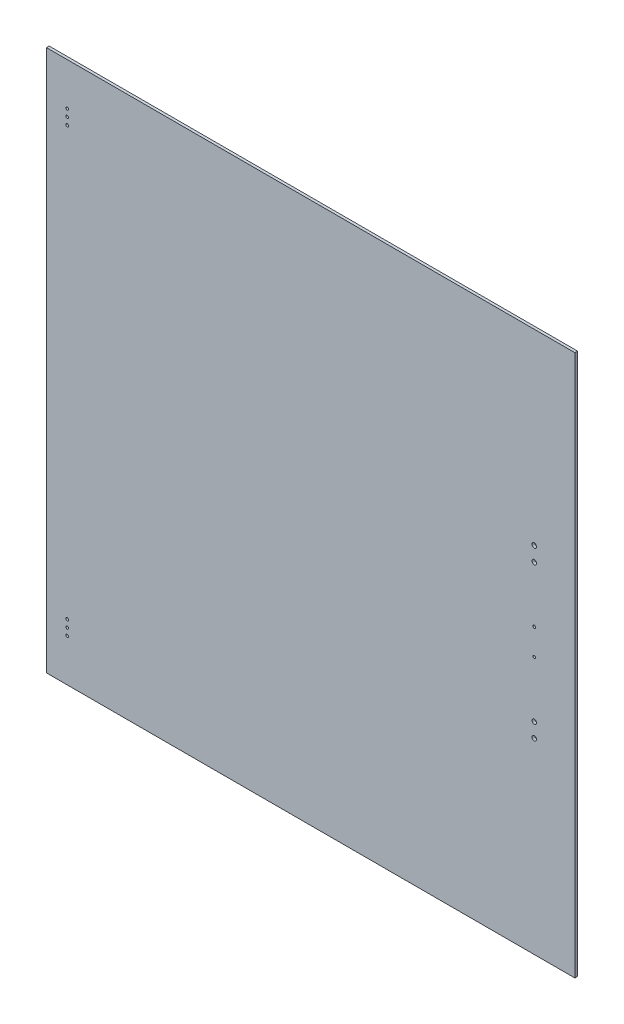
ISO-10303-21;
HEADER;
FILE_DESCRIPTION(('STEP AP214'),'2;1');
FILE_NAME('part.step','',(''),(''),'','','');
FILE_SCHEMA(('AUTOMOTIVE_DESIGN { 1 0 10303 214 1 1 1 1 }'));
ENDSEC;
DATA;
#1=APPLICATION_CONTEXT('core data for automotive mechanical design processes');
#2=APPLICATION_PROTOCOL_DEFINITION('international standard','automotive_design',2000,#1);
#3=PRODUCT_CONTEXT('',#1,'mechanical');
#4=PRODUCT('Part','Part','',(#3));
#5=PRODUCT_RELATED_PRODUCT_CATEGORY('part','',(#4));
#6=PRODUCT_DEFINITION_FORMATION('','',#4);
#7=PRODUCT_DEFINITION_CONTEXT('part definition',#1,'design');
#8=PRODUCT_DEFINITION('design','',#6,#7);
#9=PRODUCT_DEFINITION_SHAPE('','',#8);
#10=(LENGTH_UNIT() NAMED_UNIT(*) SI_UNIT(.MILLI.,.METRE.));
#11=(NAMED_UNIT(*) PLANE_ANGLE_UNIT() SI_UNIT($,.RADIAN.));
#12=(NAMED_UNIT(*) SI_UNIT($,.STERADIAN.) SOLID_ANGLE_UNIT());
#13=UNCERTAINTY_MEASURE_WITH_UNIT(LENGTH_MEASURE(1.E-05),#10,'distance_accuracy_value','');
#14=(GEOMETRIC_REPRESENTATION_CONTEXT(3) GLOBAL_UNCERTAINTY_ASSIGNED_CONTEXT((#13)) GLOBAL_UNIT_ASSIGNED_CONTEXT((#10,
#11,#12)) REPRESENTATION_CONTEXT('',''));
#15=CARTESIAN_POINT('',(0.,0.,0.));
#16=DIRECTION('',(0.,0.,1.));
#17=DIRECTION('',(1.,0.,0.));
#18=AXIS2_PLACEMENT_3D('',#15,#16,#17);
#19=CARTESIAN_POINT('',(-476.504854368932,294.757281553398,3.));
#20=DIRECTION('',(1.,0.,0.));
#21=DIRECTION('',(0.,0.,-1.));
#22=AXIS2_PLACEMENT_3D('',#19,#20,#21);
#23=PLANE('',#22);
#24=DIRECTION('',(0.,-1.,0.));
#25=VECTOR('',#24,1.);
#26=CARTESIAN_POINT('',(-476.504854368932,294.757281553398,0.));
#27=LINE('',#26,#25);
#28=CARTESIAN_POINT('',(-476.504854368932,294.757281553398,0.));
#29=VERTEX_POINT('',#28);
#30=CARTESIAN_POINT('',(-476.504854368932,-305.242718446602,0.));
#31=VERTEX_POINT('',#30);
#32=EDGE_CURVE('E96',#29,#31,#27,.T.);
#33=ORIENTED_EDGE('',*,*,#32,.T.);
#34=DIRECTION('',(0.,0.,-1.));
#35=VECTOR('',#34,1.);
#36=CARTESIAN_POINT('',(-476.504854368932,-305.242718446602,3.));
#37=LINE('',#36,#35);
#38=CARTESIAN_POINT('',(-476.504854368932,-305.242718446602,3.));
#39=VERTEX_POINT('',#38);
#40=EDGE_CURVE('E11',#39,#31,#37,.T.);
#41=ORIENTED_EDGE('',*,*,#40,.F.);
#42=DIRECTION('',(0.,-1.,0.));
#43=VECTOR('',#42,1.);
#44=CARTESIAN_POINT('',(-476.504854368932,294.757281553398,3.));
#45=LINE('',#44,#43);
#46=CARTESIAN_POINT('',(-476.504854368932,294.757281553398,3.));
#47=VERTEX_POINT('',#46);
#48=EDGE_CURVE('E84',#47,#39,#45,.T.);
#49=ORIENTED_EDGE('',*,*,#48,.F.);
#50=DIRECTION('',(0.,0.,-1.));
#51=VECTOR('',#50,1.);
#52=CARTESIAN_POINT('',(-476.504854368932,294.757281553398,3.));
#53=LINE('',#52,#51);
#54=EDGE_CURVE('E92',#47,#29,#53,.T.);
#55=ORIENTED_EDGE('',*,*,#54,.T.);
#56=EDGE_LOOP('',(#33,#41,#49,#55));
#57=FACE_BOUND('',#56,.T.);
#58=ADVANCED_FACE('F33',(#57),#23,.F.);
#59=CARTESIAN_POINT('',(-476.504854368932,-305.242718446602,3.));
#60=DIRECTION('',(0.,1.,0.));
#61=DIRECTION('',(0.,0.,1.));
#62=AXIS2_PLACEMENT_3D('',#59,#60,#61);
#63=PLANE('',#62);
#64=DIRECTION('',(1.,0.,0.));
#65=VECTOR('',#64,1.);
#66=CARTESIAN_POINT('',(-476.504854368932,-305.242718446602,0.));
#67=LINE('',#66,#65);
#68=CARTESIAN_POINT('',(108.995145631068,-305.242718446602,0.));
#69=VERTEX_POINT('',#68);
#70=EDGE_CURVE('E88',#31,#69,#67,.T.);
#71=ORIENTED_EDGE('',*,*,#70,.T.);
#72=DIRECTION('',(0.,0.,-1.));
#73=VECTOR('',#72,1.);
#74=CARTESIAN_POINT('',(108.995145631068,-305.242718446602,3.));
#75=LINE('',#74,#73);
#76=CARTESIAN_POINT('',(108.995145631068,-305.242718446602,3.));
#77=VERTEX_POINT('',#76);
#78=EDGE_CURVE('E41',#77,#69,#75,.T.);
#79=ORIENTED_EDGE('',*,*,#78,.F.);
#80=DIRECTION('',(1.,0.,0.));
#81=VECTOR('',#80,1.);
#82=CARTESIAN_POINT('',(-476.504854368932,-305.242718446602,3.));
#83=LINE('',#82,#81);
#84=EDGE_CURVE('E79',#39,#77,#83,.T.);
#85=ORIENTED_EDGE('',*,*,#84,.F.);
#86=ORIENTED_EDGE('',*,*,#40,.T.);
#87=EDGE_LOOP('',(#71,#79,#85,#86));
#88=FACE_BOUND('',#87,.T.);
#89=ADVANCED_FACE('F87',(#88),#63,.F.);
#90=CARTESIAN_POINT('',(108.995145631068,294.757281553398,3.));
#91=DIRECTION('',(-1.,0.,0.));
#92=DIRECTION('',(0.,-1.,0.));
#93=AXIS2_PLACEMENT_3D('',#90,#91,#92);
#94=PLANE('',#93);
#95=DIRECTION('',(0.,1.,0.));
#96=VECTOR('',#95,1.);
#97=CARTESIAN_POINT('',(108.995145631068,294.757281553398,0.));
#98=LINE('',#97,#96);
#99=CARTESIAN_POINT('',(108.995145631068,294.757281553398,0.));
#100=VERTEX_POINT('',#99);
#101=EDGE_CURVE('E66',#69,#100,#98,.T.);
#102=ORIENTED_EDGE('',*,*,#101,.T.);
#103=DIRECTION('',(0.,0.,-1.));
#104=VECTOR('',#103,1.);
#105=CARTESIAN_POINT('',(108.995145631068,294.757281553398,3.));
#106=LINE('',#105,#104);
#107=CARTESIAN_POINT('',(108.995145631068,294.757281553398,3.));
#108=VERTEX_POINT('',#107);
#109=EDGE_CURVE('E89',#108,#100,#106,.T.);
#110=ORIENTED_EDGE('',*,*,#109,.F.);
#111=DIRECTION('',(0.,1.,0.));
#112=VECTOR('',#111,1.);
#113=CARTESIAN_POINT('',(108.995145631068,294.757281553398,3.));
#114=LINE('',#113,#112);
#115=EDGE_CURVE('E82',#77,#108,#114,.T.);
#116=ORIENTED_EDGE('',*,*,#115,.F.);
#117=ORIENTED_EDGE('',*,*,#78,.T.);
#118=EDGE_LOOP('',(#102,#110,#116,#117));
#119=FACE_BOUND('',#118,.T.);
#120=ADVANCED_FACE('F90',(#119),#94,.F.);
#121=CARTESIAN_POINT('',(-476.504854368932,294.757281553398,3.));
#122=DIRECTION('',(0.,-1.,0.));
#123=DIRECTION('',(0.,0.,-1.));
#124=AXIS2_PLACEMENT_3D('',#121,#122,#123);
#125=PLANE('',#124);
#126=DIRECTION('',(-1.,0.,0.));
#127=VECTOR('',#126,1.);
#128=CARTESIAN_POINT('',(-476.504854368932,294.757281553398,0.));
#129=LINE('',#128,#127);
#130=EDGE_CURVE('E72',#100,#29,#129,.T.);
#131=ORIENTED_EDGE('',*,*,#130,.T.);
#132=ORIENTED_EDGE('',*,*,#54,.F.);
#133=DIRECTION('',(-1.,0.,0.));
#134=VECTOR('',#133,1.);
#135=CARTESIAN_POINT('',(-476.504854368932,294.757281553398,3.));
#136=LINE('',#135,#134);
#137=EDGE_CURVE('E49',#108,#47,#136,.T.);
#138=ORIENTED_EDGE('',*,*,#137,.F.);
#139=ORIENTED_EDGE('',*,*,#109,.T.);
#140=EDGE_LOOP('',(#131,#132,#138,#139));
#141=FACE_BOUND('',#140,.T.);
#142=ADVANCED_FACE('F104',(#141),#125,.F.);
#143=CARTESIAN_POINT('',(0.,0.,3.));
#144=DIRECTION('',(0.,0.,1.));
#145=DIRECTION('',(1.,0.,0.));
#146=AXIS2_PLACEMENT_3D('',#143,#144,#145);
#147=PLANE('',#146);
#148=CARTESIAN_POINT('',(63.995145631068,87.257281553398,3.));
#149=DIRECTION('',(0.,0.,1.));
#150=DIRECTION('',(1.,0.,0.));
#151=AXIS2_PLACEMENT_3D('',#148,#149,#150);
#152=CIRCLE('',#151,2.5);
#153=CARTESIAN_POINT('',(66.495145631068,87.257281553398,3.));
#154=VERTEX_POINT('',#153);
#155=EDGE_CURVE('E159',#154,#154,#152,.T.);
#156=ORIENTED_EDGE('',*,*,#155,.F.);
#157=EDGE_LOOP('',(#156));
#158=FACE_BOUND('',#157,.T.);
#159=CARTESIAN_POINT('',(63.995145631068,-19.742718446602,3.));
#160=DIRECTION('',(0.,0.,1.));
#161=DIRECTION('',(1.,0.,0.));
#162=AXIS2_PLACEMENT_3D('',#159,#160,#161);
#163=CIRCLE('',#162,1.49999999999998);
#164=CARTESIAN_POINT('',(65.495145631068,-19.742718446602,3.));
#165=VERTEX_POINT('',#164);
#166=EDGE_CURVE('E172',#165,#165,#163,.T.);
#167=ORIENTED_EDGE('',*,*,#166,.F.);
#168=EDGE_LOOP('',(#167));
#169=FACE_BOUND('',#168,.T.);
#170=CARTESIAN_POINT('',(63.9951456310681,71.257281553398,3.));
#171=DIRECTION('',(0.,0.,1.));
#172=DIRECTION('',(1.,0.,0.));
#173=AXIS2_PLACEMENT_3D('',#170,#171,#172);
#174=CIRCLE('',#173,2.5);
#175=CARTESIAN_POINT('',(66.4951456310681,71.257281553398,3.));
#176=VERTEX_POINT('',#175);
#177=EDGE_CURVE('E153',#176,#176,#174,.T.);
#178=ORIENTED_EDGE('',*,*,#177,.F.);
#179=EDGE_LOOP('',(#178));
#180=FACE_BOUND('',#179,.T.);
#181=CARTESIAN_POINT('',(63.995145631068,-81.742718446602,3.));
#182=DIRECTION('',(0.,0.,1.));
#183=DIRECTION('',(1.,0.,0.));
#184=AXIS2_PLACEMENT_3D('',#181,#182,#183);
#185=CIRCLE('',#184,2.50000000000001);
#186=CARTESIAN_POINT('',(66.495145631068,-81.742718446602,3.));
#187=VERTEX_POINT('',#186);
#188=EDGE_CURVE('E146',#187,#187,#185,.T.);
#189=ORIENTED_EDGE('',*,*,#188,.F.);
#190=EDGE_LOOP('',(#189));
#191=FACE_BOUND('',#190,.T.);
#192=CARTESIAN_POINT('',(63.995145631068,-97.742718446602,3.));
#193=DIRECTION('',(0.,0.,1.));
#194=DIRECTION('',(1.,0.,0.));
#195=AXIS2_PLACEMENT_3D('',#192,#193,#194);
#196=CIRCLE('',#195,2.50000000000001);
#197=CARTESIAN_POINT('',(66.495145631068,-97.742718446602,3.));
#198=VERTEX_POINT('',#197);
#199=EDGE_CURVE('E167',#198,#198,#196,.T.);
#200=ORIENTED_EDGE('',*,*,#199,.F.);
#201=EDGE_LOOP('',(#200));
#202=FACE_BOUND('',#201,.T.);
#203=CARTESIAN_POINT('',(63.995145631068,9.25728155339803,3.));
#204=DIRECTION('',(0.,0.,1.));
#205=DIRECTION('',(1.,0.,0.));
#206=AXIS2_PLACEMENT_3D('',#203,#204,#205);
#207=CIRCLE('',#206,1.49999999999998);
#208=CARTESIAN_POINT('',(65.495145631068,9.25728155339803,3.));
#209=VERTEX_POINT('',#208);
#210=EDGE_CURVE('E160',#209,#209,#207,.T.);
#211=ORIENTED_EDGE('',*,*,#210,.F.);
#212=EDGE_LOOP('',(#211));
#213=FACE_BOUND('',#212,.T.);
#214=CARTESIAN_POINT('',(-453.504854368932,247.757281553398,3.));
#215=DIRECTION('',(0.,0.,1.));
#216=DIRECTION('',(1.,0.,0.));
#217=AXIS2_PLACEMENT_3D('',#214,#215,#216);
#218=CIRCLE('',#217,1.50000000000002);
#219=CARTESIAN_POINT('',(-452.004854368932,247.757281553398,3.));
#220=VERTEX_POINT('',#219);
#221=EDGE_CURVE('E141',#220,#220,#218,.T.);
#222=ORIENTED_EDGE('',*,*,#221,.F.);
#223=EDGE_LOOP('',(#222));
#224=FACE_BOUND('',#223,.T.);
#225=CARTESIAN_POINT('',(-453.504854368932,239.757281553398,3.));
#226=DIRECTION('',(0.,0.,1.));
#227=DIRECTION('',(1.,0.,0.));
#228=AXIS2_PLACEMENT_3D('',#225,#226,#227);
#229=CIRCLE('',#228,1.50000000000002);
#230=CARTESIAN_POINT('',(-452.004854368932,239.757281553398,3.));
#231=VERTEX_POINT('',#230);
#232=EDGE_CURVE('E135',#231,#231,#229,.T.);
#233=ORIENTED_EDGE('',*,*,#232,.F.);
#234=EDGE_LOOP('',(#233));
#235=FACE_BOUND('',#234,.T.);
#236=CARTESIAN_POINT('',(-453.504854368932,231.757281553398,3.));
#237=DIRECTION('',(0.,0.,1.));
#238=DIRECTION('',(1.,0.,0.));
#239=AXIS2_PLACEMENT_3D('',#236,#237,#238);
#240=CIRCLE('',#239,1.50000000000002);
#241=CARTESIAN_POINT('',(-452.004854368932,231.757281553398,3.));
#242=VERTEX_POINT('',#241);
#243=EDGE_CURVE('E129',#242,#242,#240,.T.);
#244=ORIENTED_EDGE('',*,*,#243,.F.);
#245=EDGE_LOOP('',(#244));
#246=FACE_BOUND('',#245,.T.);
#247=CARTESIAN_POINT('',(-453.504854368932,-242.242718446602,3.));
#248=DIRECTION('',(0.,0.,1.));
#249=DIRECTION('',(1.,0.,0.));
#250=AXIS2_PLACEMENT_3D('',#247,#248,#249);
#251=CIRCLE('',#250,1.50000000000002);
#252=CARTESIAN_POINT('',(-452.004854368932,-242.242718446602,3.));
#253=VERTEX_POINT('',#252);
#254=EDGE_CURVE('E123',#253,#253,#251,.T.);
#255=ORIENTED_EDGE('',*,*,#254,.F.);
#256=EDGE_LOOP('',(#255));
#257=FACE_BOUND('',#256,.T.);
#258=CARTESIAN_POINT('',(-453.504854368932,-250.242718446602,3.));
#259=DIRECTION('',(0.,0.,1.));
#260=DIRECTION('',(1.,0.,0.));
#261=AXIS2_PLACEMENT_3D('',#258,#259,#260);
#262=CIRCLE('',#261,1.50000000000002);
#263=CARTESIAN_POINT('',(-452.004854368932,-250.242718446602,3.));
#264=VERTEX_POINT('',#263);
#265=EDGE_CURVE('E117',#264,#264,#262,.T.);
#266=ORIENTED_EDGE('',*,*,#265,.F.);
#267=EDGE_LOOP('',(#266));
#268=FACE_BOUND('',#267,.T.);
#269=CARTESIAN_POINT('',(-453.504854368932,-258.242718446602,3.));
#270=DIRECTION('',(0.,0.,1.));
#271=DIRECTION('',(1.,0.,0.));
#272=AXIS2_PLACEMENT_3D('',#269,#270,#271);
#273=CIRCLE('',#272,1.50000000000002);
#274=CARTESIAN_POINT('',(-452.004854368932,-258.242718446602,3.));
#275=VERTEX_POINT('',#274);
#276=EDGE_CURVE('E110',#275,#275,#273,.T.);
#277=ORIENTED_EDGE('',*,*,#276,.F.);
#278=EDGE_LOOP('',(#277));
#279=FACE_BOUND('',#278,.T.);
#280=ORIENTED_EDGE('',*,*,#48,.T.);
#281=ORIENTED_EDGE('',*,*,#84,.T.);
#282=ORIENTED_EDGE('',*,*,#115,.T.);
#283=ORIENTED_EDGE('',*,*,#137,.T.);
#284=EDGE_LOOP('',(#280,#281,#282,#283));
#285=FACE_BOUND('',#284,.T.);
#286=ADVANCED_FACE('F80',(#158,#169,#180,#191,#202,#213,#224,#235,#246,#257,#268,#279,#285),
#147,.T.);
#287=CARTESIAN_POINT('',(0.,0.,0.));
#288=DIRECTION('',(0.,0.,1.));
#289=DIRECTION('',(1.,0.,0.));
#290=AXIS2_PLACEMENT_3D('',#287,#288,#289);
#291=PLANE('',#290);
#292=CARTESIAN_POINT('',(63.995145631068,87.257281553398,0.));
#293=DIRECTION('',(0.,0.,1.));
#294=DIRECTION('',(1.,0.,0.));
#295=AXIS2_PLACEMENT_3D('',#292,#293,#294);
#296=CIRCLE('',#295,2.5);
#297=CARTESIAN_POINT('',(66.495145631068,87.257281553398,0.));
#298=VERTEX_POINT('',#297);
#299=EDGE_CURVE('E114',#298,#298,#296,.T.);
#300=ORIENTED_EDGE('',*,*,#299,.T.);
#301=EDGE_LOOP('',(#300));
#302=FACE_BOUND('',#301,.T.);
#303=CARTESIAN_POINT('',(63.995145631068,-19.742718446602,0.));
#304=DIRECTION('',(0.,0.,1.));
#305=DIRECTION('',(1.,0.,0.));
#306=AXIS2_PLACEMENT_3D('',#303,#304,#305);
#307=CIRCLE('',#306,1.49999999999998);
#308=CARTESIAN_POINT('',(65.495145631068,-19.742718446602,0.));
#309=VERTEX_POINT('',#308);
#310=EDGE_CURVE('E164',#309,#309,#307,.T.);
#311=ORIENTED_EDGE('',*,*,#310,.T.);
#312=EDGE_LOOP('',(#311));
#313=FACE_BOUND('',#312,.T.);
#314=CARTESIAN_POINT('',(63.9951456310681,71.257281553398,0.));
#315=DIRECTION('',(0.,0.,1.));
#316=DIRECTION('',(1.,0.,0.));
#317=AXIS2_PLACEMENT_3D('',#314,#315,#316);
#318=CIRCLE('',#317,2.5);
#319=CARTESIAN_POINT('',(66.4951456310681,71.257281553398,0.));
#320=VERTEX_POINT('',#319);
#321=EDGE_CURVE('E156',#320,#320,#318,.T.);
#322=ORIENTED_EDGE('',*,*,#321,.T.);
#323=EDGE_LOOP('',(#322));
#324=FACE_BOUND('',#323,.T.);
#325=CARTESIAN_POINT('',(63.995145631068,-81.742718446602,0.));
#326=DIRECTION('',(0.,0.,1.));
#327=DIRECTION('',(1.,0.,0.));
#328=AXIS2_PLACEMENT_3D('',#325,#326,#327);
#329=CIRCLE('',#328,2.50000000000001);
#330=CARTESIAN_POINT('',(66.495145631068,-81.742718446602,0.));
#331=VERTEX_POINT('',#330);
#332=EDGE_CURVE('E149',#331,#331,#329,.T.);
#333=ORIENTED_EDGE('',*,*,#332,.T.);
#334=EDGE_LOOP('',(#333));
#335=FACE_BOUND('',#334,.T.);
#336=CARTESIAN_POINT('',(63.995145631068,-97.742718446602,0.));
#337=DIRECTION('',(0.,0.,1.));
#338=DIRECTION('',(1.,0.,0.));
#339=AXIS2_PLACEMENT_3D('',#336,#337,#338);
#340=CIRCLE('',#339,2.50000000000001);
#341=CARTESIAN_POINT('',(66.495145631068,-97.742718446602,0.));
#342=VERTEX_POINT('',#341);
#343=EDGE_CURVE('E150',#342,#342,#340,.T.);
#344=ORIENTED_EDGE('',*,*,#343,.T.);
#345=EDGE_LOOP('',(#344));
#346=FACE_BOUND('',#345,.T.);
#347=CARTESIAN_POINT('',(63.995145631068,9.25728155339803,0.));
#348=DIRECTION('',(0.,0.,1.));
#349=DIRECTION('',(1.,0.,0.));
#350=AXIS2_PLACEMENT_3D('',#347,#348,#349);
#351=CIRCLE('',#350,1.49999999999998);
#352=CARTESIAN_POINT('',(65.495145631068,9.25728155339803,0.));
#353=VERTEX_POINT('',#352);
#354=EDGE_CURVE('E163',#353,#353,#351,.T.);
#355=ORIENTED_EDGE('',*,*,#354,.T.);
#356=EDGE_LOOP('',(#355));
#357=FACE_BOUND('',#356,.T.);
#358=CARTESIAN_POINT('',(-453.504854368932,247.757281553398,0.));
#359=DIRECTION('',(0.,0.,1.));
#360=DIRECTION('',(1.,0.,0.));
#361=AXIS2_PLACEMENT_3D('',#358,#359,#360);
#362=CIRCLE('',#361,1.50000000000002);
#363=CARTESIAN_POINT('',(-452.004854368932,247.757281553398,0.));
#364=VERTEX_POINT('',#363);
#365=EDGE_CURVE('E99',#364,#364,#362,.T.);
#366=ORIENTED_EDGE('',*,*,#365,.T.);
#367=EDGE_LOOP('',(#366));
#368=FACE_BOUND('',#367,.T.);
#369=CARTESIAN_POINT('',(-453.504854368932,239.757281553398,0.));
#370=DIRECTION('',(0.,0.,1.));
#371=DIRECTION('',(1.,0.,0.));
#372=AXIS2_PLACEMENT_3D('',#369,#370,#371);
#373=CIRCLE('',#372,1.50000000000002);
#374=CARTESIAN_POINT('',(-452.004854368932,239.757281553398,0.));
#375=VERTEX_POINT('',#374);
#376=EDGE_CURVE('E138',#375,#375,#373,.T.);
#377=ORIENTED_EDGE('',*,*,#376,.T.);
#378=EDGE_LOOP('',(#377));
#379=FACE_BOUND('',#378,.T.);
#380=CARTESIAN_POINT('',(-453.504854368932,231.757281553398,0.));
#381=DIRECTION('',(0.,0.,1.));
#382=DIRECTION('',(1.,0.,0.));
#383=AXIS2_PLACEMENT_3D('',#380,#381,#382);
#384=CIRCLE('',#383,1.50000000000002);
#385=CARTESIAN_POINT('',(-452.004854368932,231.757281553398,0.));
#386=VERTEX_POINT('',#385);
#387=EDGE_CURVE('E132',#386,#386,#384,.T.);
#388=ORIENTED_EDGE('',*,*,#387,.T.);
#389=EDGE_LOOP('',(#388));
#390=FACE_BOUND('',#389,.T.);
#391=CARTESIAN_POINT('',(-453.504854368932,-242.242718446602,0.));
#392=DIRECTION('',(0.,0.,1.));
#393=DIRECTION('',(1.,0.,0.));
#394=AXIS2_PLACEMENT_3D('',#391,#392,#393);
#395=CIRCLE('',#394,1.50000000000002);
#396=CARTESIAN_POINT('',(-452.004854368932,-242.242718446602,0.));
#397=VERTEX_POINT('',#396);
#398=EDGE_CURVE('E126',#397,#397,#395,.T.);
#399=ORIENTED_EDGE('',*,*,#398,.T.);
#400=EDGE_LOOP('',(#399));
#401=FACE_BOUND('',#400,.T.);
#402=CARTESIAN_POINT('',(-453.504854368932,-250.242718446602,0.));
#403=DIRECTION('',(0.,0.,1.));
#404=DIRECTION('',(1.,0.,0.));
#405=AXIS2_PLACEMENT_3D('',#402,#403,#404);
#406=CIRCLE('',#405,1.50000000000002);
#407=CARTESIAN_POINT('',(-452.004854368932,-250.242718446602,0.));
#408=VERTEX_POINT('',#407);
#409=EDGE_CURVE('E120',#408,#408,#406,.T.);
#410=ORIENTED_EDGE('',*,*,#409,.T.);
#411=EDGE_LOOP('',(#410));
#412=FACE_BOUND('',#411,.T.);
#413=CARTESIAN_POINT('',(-453.504854368932,-258.242718446602,0.));
#414=DIRECTION('',(0.,0.,1.));
#415=DIRECTION('',(1.,0.,0.));
#416=AXIS2_PLACEMENT_3D('',#413,#414,#415);
#417=CIRCLE('',#416,1.50000000000002);
#418=CARTESIAN_POINT('',(-452.004854368932,-258.242718446602,0.));
#419=VERTEX_POINT('',#418);
#420=EDGE_CURVE('E113',#419,#419,#417,.T.);
#421=ORIENTED_EDGE('',*,*,#420,.T.);
#422=EDGE_LOOP('',(#421));
#423=FACE_BOUND('',#422,.T.);
#424=ORIENTED_EDGE('',*,*,#32,.F.);
#425=ORIENTED_EDGE('',*,*,#130,.F.);
#426=ORIENTED_EDGE('',*,*,#101,.F.);
#427=ORIENTED_EDGE('',*,*,#70,.F.);
#428=EDGE_LOOP('',(#424,#425,#426,#427));
#429=FACE_BOUND('',#428,.T.);
#430=ADVANCED_FACE('F107',(#302,#313,#324,#335,#346,#357,#368,#379,#390,#401,#412,#423,#429),
#291,.F.);
#431=CARTESIAN_POINT('',(-453.504854368932,-258.242718446602,0.));
#432=DIRECTION('',(0.,0.,1.));
#433=DIRECTION('',(1.,0.,0.));
#434=AXIS2_PLACEMENT_3D('',#431,#432,#433);
#435=CYLINDRICAL_SURFACE('',#434,1.50000000000002);
#436=ORIENTED_EDGE('',*,*,#420,.F.);
#437=EDGE_LOOP('',(#436));
#438=FACE_BOUND('',#437,.T.);
#439=ORIENTED_EDGE('',*,*,#276,.T.);
#440=EDGE_LOOP('',(#439));
#441=FACE_BOUND('',#440,.T.);
#442=ADVANCED_FACE('F216',(#438,#441),#435,.F.);
#443=CARTESIAN_POINT('',(-453.504854368932,-250.242718446602,0.));
#444=DIRECTION('',(0.,0.,1.));
#445=DIRECTION('',(1.,0.,0.));
#446=AXIS2_PLACEMENT_3D('',#443,#444,#445);
#447=CYLINDRICAL_SURFACE('',#446,1.50000000000002);
#448=ORIENTED_EDGE('',*,*,#409,.F.);
#449=EDGE_LOOP('',(#448));
#450=FACE_BOUND('',#449,.T.);
#451=ORIENTED_EDGE('',*,*,#265,.T.);
#452=EDGE_LOOP('',(#451));
#453=FACE_BOUND('',#452,.T.);
#454=ADVANCED_FACE('F218',(#450,#453),#447,.F.);
#455=CARTESIAN_POINT('',(-453.504854368932,-242.242718446602,0.));
#456=DIRECTION('',(0.,0.,1.));
#457=DIRECTION('',(1.,0.,0.));
#458=AXIS2_PLACEMENT_3D('',#455,#456,#457);
#459=CYLINDRICAL_SURFACE('',#458,1.50000000000002);
#460=ORIENTED_EDGE('',*,*,#398,.F.);
#461=EDGE_LOOP('',(#460));
#462=FACE_BOUND('',#461,.T.);
#463=ORIENTED_EDGE('',*,*,#254,.T.);
#464=EDGE_LOOP('',(#463));
#465=FACE_BOUND('',#464,.T.);
#466=ADVANCED_FACE('F225',(#462,#465),#459,.F.);
#467=CARTESIAN_POINT('',(-453.504854368932,231.757281553398,0.));
#468=DIRECTION('',(0.,0.,1.));
#469=DIRECTION('',(1.,0.,0.));
#470=AXIS2_PLACEMENT_3D('',#467,#468,#469);
#471=CYLINDRICAL_SURFACE('',#470,1.50000000000002);
#472=ORIENTED_EDGE('',*,*,#387,.F.);
#473=EDGE_LOOP('',(#472));
#474=FACE_BOUND('',#473,.T.);
#475=ORIENTED_EDGE('',*,*,#243,.T.);
#476=EDGE_LOOP('',(#475));
#477=FACE_BOUND('',#476,.T.);
#478=ADVANCED_FACE('F324',(#474,#477),#471,.F.);
#479=CARTESIAN_POINT('',(-453.504854368932,239.757281553398,0.));
#480=DIRECTION('',(0.,0.,1.));
#481=DIRECTION('',(1.,0.,0.));
#482=AXIS2_PLACEMENT_3D('',#479,#480,#481);
#483=CYLINDRICAL_SURFACE('',#482,1.50000000000002);
#484=ORIENTED_EDGE('',*,*,#376,.F.);
#485=EDGE_LOOP('',(#484));
#486=FACE_BOUND('',#485,.T.);
#487=ORIENTED_EDGE('',*,*,#232,.T.);
#488=EDGE_LOOP('',(#487));
#489=FACE_BOUND('',#488,.T.);
#490=ADVANCED_FACE('F320',(#486,#489),#483,.F.);
#491=CARTESIAN_POINT('',(-453.504854368932,247.757281553398,0.));
#492=DIRECTION('',(0.,0.,1.));
#493=DIRECTION('',(1.,0.,0.));
#494=AXIS2_PLACEMENT_3D('',#491,#492,#493);
#495=CYLINDRICAL_SURFACE('',#494,1.50000000000002);
#496=ORIENTED_EDGE('',*,*,#365,.F.);
#497=EDGE_LOOP('',(#496));
#498=FACE_BOUND('',#497,.T.);
#499=ORIENTED_EDGE('',*,*,#221,.T.);
#500=EDGE_LOOP('',(#499));
#501=FACE_BOUND('',#500,.T.);
#502=ADVANCED_FACE('F265',(#498,#501),#495,.F.);
#503=CARTESIAN_POINT('',(63.995145631068,9.25728155339803,0.));
#504=DIRECTION('',(0.,0.,1.));
#505=DIRECTION('',(1.,0.,0.));
#506=AXIS2_PLACEMENT_3D('',#503,#504,#505);
#507=CYLINDRICAL_SURFACE('',#506,1.49999999999998);
#508=ORIENTED_EDGE('',*,*,#354,.F.);
#509=EDGE_LOOP('',(#508));
#510=FACE_BOUND('',#509,.T.);
#511=ORIENTED_EDGE('',*,*,#210,.T.);
#512=EDGE_LOOP('',(#511));
#513=FACE_BOUND('',#512,.T.);
#514=ADVANCED_FACE('F259',(#510,#513),#507,.F.);
#515=CARTESIAN_POINT('',(63.995145631068,-97.742718446602,0.));
#516=DIRECTION('',(0.,0.,1.));
#517=DIRECTION('',(1.,0.,0.));
#518=AXIS2_PLACEMENT_3D('',#515,#516,#517);
#519=CYLINDRICAL_SURFACE('',#518,2.50000000000001);
#520=ORIENTED_EDGE('',*,*,#343,.F.);
#521=EDGE_LOOP('',(#520));
#522=FACE_BOUND('',#521,.T.);
#523=ORIENTED_EDGE('',*,*,#199,.T.);
#524=EDGE_LOOP('',(#523));
#525=FACE_BOUND('',#524,.T.);
#526=ADVANCED_FACE('F264',(#522,#525),#519,.F.);
#527=CARTESIAN_POINT('',(63.995145631068,-81.742718446602,0.));
#528=DIRECTION('',(0.,0.,1.));
#529=DIRECTION('',(1.,0.,0.));
#530=AXIS2_PLACEMENT_3D('',#527,#528,#529);
#531=CYLINDRICAL_SURFACE('',#530,2.50000000000001);
#532=ORIENTED_EDGE('',*,*,#332,.F.);
#533=EDGE_LOOP('',(#532));
#534=FACE_BOUND('',#533,.T.);
#535=ORIENTED_EDGE('',*,*,#188,.T.);
#536=EDGE_LOOP('',(#535));
#537=FACE_BOUND('',#536,.T.);
#538=ADVANCED_FACE('F277',(#534,#537),#531,.F.);
#539=CARTESIAN_POINT('',(63.9951456310681,71.257281553398,0.));
#540=DIRECTION('',(0.,0.,1.));
#541=DIRECTION('',(1.,0.,0.));
#542=AXIS2_PLACEMENT_3D('',#539,#540,#541);
#543=CYLINDRICAL_SURFACE('',#542,2.5);
#544=ORIENTED_EDGE('',*,*,#321,.F.);
#545=EDGE_LOOP('',(#544));
#546=FACE_BOUND('',#545,.T.);
#547=ORIENTED_EDGE('',*,*,#177,.T.);
#548=EDGE_LOOP('',(#547));
#549=FACE_BOUND('',#548,.T.);
#550=ADVANCED_FACE('F287',(#546,#549),#543,.F.);
#551=CARTESIAN_POINT('',(63.995145631068,-19.742718446602,0.));
#552=DIRECTION('',(0.,0.,1.));
#553=DIRECTION('',(1.,0.,0.));
#554=AXIS2_PLACEMENT_3D('',#551,#552,#553);
#555=CYLINDRICAL_SURFACE('',#554,1.49999999999998);
#556=ORIENTED_EDGE('',*,*,#310,.F.);
#557=EDGE_LOOP('',(#556));
#558=FACE_BOUND('',#557,.T.);
#559=ORIENTED_EDGE('',*,*,#166,.T.);
#560=EDGE_LOOP('',(#559));
#561=FACE_BOUND('',#560,.T.);
#562=ADVANCED_FACE('F187',(#558,#561),#555,.F.);
#563=CARTESIAN_POINT('',(63.995145631068,87.257281553398,0.));
#564=DIRECTION('',(0.,0.,1.));
#565=DIRECTION('',(1.,0.,0.));
#566=AXIS2_PLACEMENT_3D('',#563,#564,#565);
#567=CYLINDRICAL_SURFACE('',#566,2.5);
#568=ORIENTED_EDGE('',*,*,#299,.F.);
#569=EDGE_LOOP('',(#568));
#570=FACE_BOUND('',#569,.T.);
#571=ORIENTED_EDGE('',*,*,#155,.T.);
#572=EDGE_LOOP('',(#571));
#573=FACE_BOUND('',#572,.T.);
#574=ADVANCED_FACE('F184',(#570,#573),#567,.F.);
#575=CLOSED_SHELL('',(#58,#89,#120,#142,#286,#430,#442,#454,#466,#478,#490,#502,#514,#526,#538,
#550,#562,#574));
#576=MANIFOLD_SOLID_BREP('B2',#575);
#577=ADVANCED_BREP_SHAPE_REPRESENTATION('',(#18,#576),#14);
#578=SHAPE_DEFINITION_REPRESENTATION(#9,#577);
ENDSEC;
END-ISO-10303-21;
